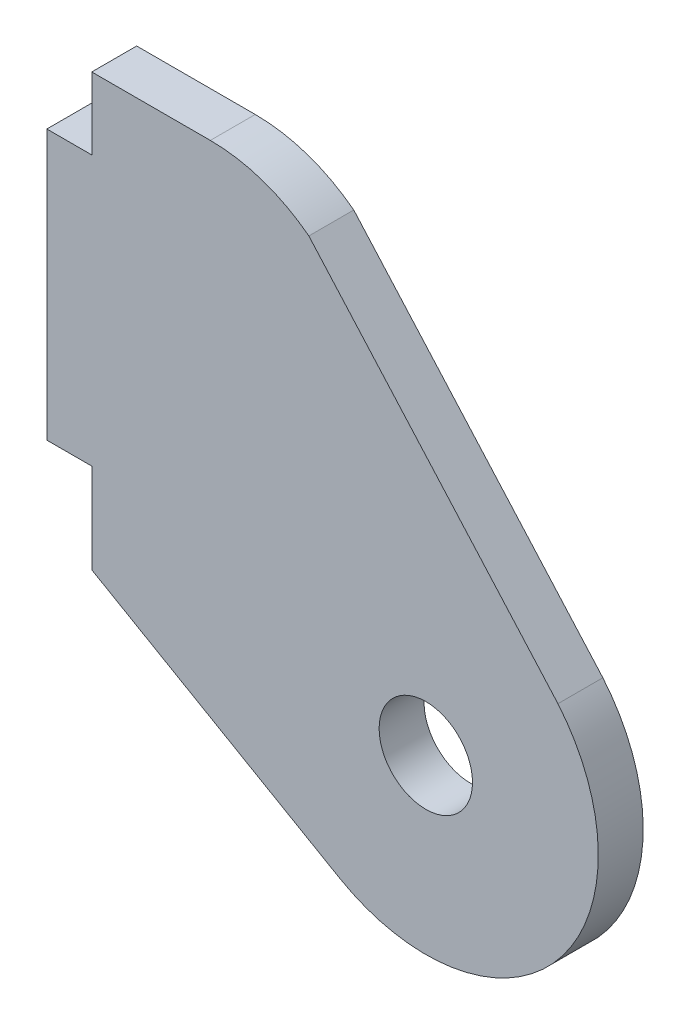
ISO-10303-21;
HEADER;
FILE_DESCRIPTION(('STEP AP214'),'2;1');
FILE_NAME('part.step','',(''),(''),'','','');
FILE_SCHEMA(('AUTOMOTIVE_DESIGN { 1 0 10303 214 1 1 1 1 }'));
ENDSEC;
DATA;
#1=APPLICATION_CONTEXT('core data for automotive mechanical design processes');
#2=APPLICATION_PROTOCOL_DEFINITION('international standard','automotive_design',2000,#1);
#3=PRODUCT_CONTEXT('',#1,'mechanical');
#4=PRODUCT('Part','Part','',(#3));
#5=PRODUCT_RELATED_PRODUCT_CATEGORY('part','',(#4));
#6=PRODUCT_DEFINITION_FORMATION('','',#4);
#7=PRODUCT_DEFINITION_CONTEXT('part definition',#1,'design');
#8=PRODUCT_DEFINITION('design','',#6,#7);
#9=PRODUCT_DEFINITION_SHAPE('','',#8);
#10=(LENGTH_UNIT() NAMED_UNIT(*) SI_UNIT(.MILLI.,.METRE.));
#11=(NAMED_UNIT(*) PLANE_ANGLE_UNIT() SI_UNIT($,.RADIAN.));
#12=(NAMED_UNIT(*) SI_UNIT($,.STERADIAN.) SOLID_ANGLE_UNIT());
#13=UNCERTAINTY_MEASURE_WITH_UNIT(LENGTH_MEASURE(1.E-05),#10,'distance_accuracy_value','');
#14=(GEOMETRIC_REPRESENTATION_CONTEXT(3) GLOBAL_UNCERTAINTY_ASSIGNED_CONTEXT((#13)) GLOBAL_UNIT_ASSIGNED_CONTEXT((#10,
#11,#12)) REPRESENTATION_CONTEXT('',''));
#15=CARTESIAN_POINT('',(0.,0.,0.));
#16=DIRECTION('',(0.,0.,1.));
#17=DIRECTION('',(1.,0.,0.));
#18=AXIS2_PLACEMENT_3D('',#15,#16,#17);
#19=CARTESIAN_POINT('',(-79.4095433377579,-48.870574021423,3.175));
#20=DIRECTION('',(0.,1.,0.));
#21=DIRECTION('',(0.,0.,1.));
#22=AXIS2_PLACEMENT_3D('',#19,#20,#21);
#23=PLANE('',#22);
#24=DIRECTION('',(1.,0.,0.));
#25=VECTOR('',#24,1.);
#26=CARTESIAN_POINT('',(-79.4095433377579,-48.870574021423,0.));
#27=LINE('',#26,#25);
#28=CARTESIAN_POINT('',(-79.4095433377579,-48.870574021423,0.));
#29=VERTEX_POINT('',#28);
#30=CARTESIAN_POINT('',(-76.2345433377579,-48.870574021423,0.));
#31=VERTEX_POINT('',#30);
#32=EDGE_CURVE('E141',#29,#31,#27,.T.);
#33=ORIENTED_EDGE('',*,*,#32,.T.);
#34=DIRECTION('',(0.,0.,-1.));
#35=VECTOR('',#34,1.);
#36=CARTESIAN_POINT('',(-76.2345433377579,-48.870574021423,3.175));
#37=LINE('',#36,#35);
#38=CARTESIAN_POINT('',(-76.2345433377579,-48.870574021423,3.175));
#39=VERTEX_POINT('',#38);
#40=EDGE_CURVE('E11',#39,#31,#37,.T.);
#41=ORIENTED_EDGE('',*,*,#40,.F.);
#42=DIRECTION('',(1.,0.,0.));
#43=VECTOR('',#42,1.);
#44=CARTESIAN_POINT('',(-79.4095433377579,-48.870574021423,3.175));
#45=LINE('',#44,#43);
#46=CARTESIAN_POINT('',(-79.4095433377579,-48.870574021423,3.175));
#47=VERTEX_POINT('',#46);
#48=EDGE_CURVE('E160',#47,#39,#45,.T.);
#49=ORIENTED_EDGE('',*,*,#48,.F.);
#50=DIRECTION('',(0.,0.,-1.));
#51=VECTOR('',#50,1.);
#52=CARTESIAN_POINT('',(-79.4095433377579,-48.870574021423,3.175));
#53=LINE('',#52,#51);
#54=EDGE_CURVE('E137',#47,#29,#53,.T.);
#55=ORIENTED_EDGE('',*,*,#54,.T.);
#56=EDGE_LOOP('',(#33,#41,#49,#55));
#57=FACE_BOUND('',#56,.T.);
#58=ADVANCED_FACE('F33',(#57),#23,.F.);
#59=CARTESIAN_POINT('',(-76.2345433377579,-48.870574021423,3.175));
#60=DIRECTION('',(1.,0.,0.));
#61=DIRECTION('',(0.,1.,0.));
#62=AXIS2_PLACEMENT_3D('',#59,#60,#61);
#63=PLANE('',#62);
#64=DIRECTION('',(0.,-1.,0.));
#65=VECTOR('',#64,1.);
#66=CARTESIAN_POINT('',(-76.2345433377579,-48.870574021423,0.));
#67=LINE('',#66,#65);
#68=CARTESIAN_POINT('',(-76.2345433377579,-55.220574021423,0.));
#69=VERTEX_POINT('',#68);
#70=EDGE_CURVE('E144',#31,#69,#67,.T.);
#71=ORIENTED_EDGE('',*,*,#70,.T.);
#72=DIRECTION('',(0.,0.,-1.));
#73=VECTOR('',#72,1.);
#74=CARTESIAN_POINT('',(-76.2345433377579,-55.220574021423,3.175));
#75=LINE('',#74,#73);
#76=CARTESIAN_POINT('',(-76.2345433377579,-55.220574021423,3.175));
#77=VERTEX_POINT('',#76);
#78=EDGE_CURVE('E41',#77,#69,#75,.T.);
#79=ORIENTED_EDGE('',*,*,#78,.F.);
#80=DIRECTION('',(0.,-1.,0.));
#81=VECTOR('',#80,1.);
#82=CARTESIAN_POINT('',(-76.2345433377579,-48.870574021423,3.175));
#83=LINE('',#82,#81);
#84=EDGE_CURVE('E98',#39,#77,#83,.T.);
#85=ORIENTED_EDGE('',*,*,#84,.F.);
#86=ORIENTED_EDGE('',*,*,#40,.T.);
#87=EDGE_LOOP('',(#71,#79,#85,#86));
#88=FACE_BOUND('',#87,.T.);
#89=ADVANCED_FACE('F228',(#88),#63,.F.);
#90=CARTESIAN_POINT('',(-76.2345433377579,-55.220574021423,3.175));
#91=DIRECTION('',(0.499999999999998,0.86602540378444,0.));
#92=DIRECTION('',(-0.86602540378444,0.499999999999998,0.));
#93=AXIS2_PLACEMENT_3D('',#90,#91,#92);
#94=PLANE('',#93);
#95=DIRECTION('',(0.86602540378444,-0.499999999999998,0.));
#96=VECTOR('',#95,1.);
#97=CARTESIAN_POINT('',(-76.2345433377579,-55.220574021423,0.));
#98=LINE('',#97,#96);
#99=CARTESIAN_POINT('',(-58.7169060337579,-65.3343866344536,0.));
#100=VERTEX_POINT('',#99);
#101=EDGE_CURVE('E147',#69,#100,#98,.T.);
#102=ORIENTED_EDGE('',*,*,#101,.T.);
#103=DIRECTION('',(0.,0.,-1.));
#104=VECTOR('',#103,1.);
#105=CARTESIAN_POINT('',(-58.7169060337579,-65.3343866344536,3.175));
#106=LINE('',#105,#104);
#107=CARTESIAN_POINT('',(-58.7169060337579,-65.3343866344536,3.175));
#108=VERTEX_POINT('',#107);
#109=EDGE_CURVE('E173',#108,#100,#106,.T.);
#110=ORIENTED_EDGE('',*,*,#109,.F.);
#111=DIRECTION('',(0.86602540378444,-0.499999999999998,0.));
#112=VECTOR('',#111,1.);
#113=CARTESIAN_POINT('',(-76.2345433377579,-55.220574021423,3.175));
#114=LINE('',#113,#112);
#115=EDGE_CURVE('E181',#77,#108,#114,.T.);
#116=ORIENTED_EDGE('',*,*,#115,.F.);
#117=ORIENTED_EDGE('',*,*,#78,.T.);
#118=EDGE_LOOP('',(#102,#110,#116,#117));
#119=FACE_BOUND('',#118,.T.);
#120=ADVANCED_FACE('F179',(#119),#94,.F.);
#121=CARTESIAN_POINT('',(-52.6209060337579,-54.7758049115137,3.175));
#122=DIRECTION('',(0.,0.,-1.));
#123=DIRECTION('',(-1.,0.,0.));
#124=AXIS2_PLACEMENT_3D('',#121,#122,#123);
#125=CYLINDRICAL_SURFACE('',#124,12.192);
#126=CARTESIAN_POINT('',(-52.6209060337579,-54.7758049115137,0.));
#127=DIRECTION('',(0.,0.,1.));
#128=DIRECTION('',(1.,0.,0.));
#129=AXIS2_PLACEMENT_3D('',#126,#127,#128);
#130=CIRCLE('',#129,12.192);
#131=CARTESIAN_POINT('',(-43.2812921832514,-46.9389383742153,0.));
#132=VERTEX_POINT('',#131);
#133=EDGE_CURVE('E149',#100,#132,#130,.T.);
#134=ORIENTED_EDGE('',*,*,#133,.T.);
#135=DIRECTION('',(0.,0.,-1.));
#136=VECTOR('',#135,1.);
#137=CARTESIAN_POINT('',(-43.2812921832514,-46.9389383742153,3.175));
#138=LINE('',#137,#136);
#139=CARTESIAN_POINT('',(-43.2812921832514,-46.9389383742153,3.175));
#140=VERTEX_POINT('',#139);
#141=EDGE_CURVE('E170',#140,#132,#138,.T.);
#142=ORIENTED_EDGE('',*,*,#141,.F.);
#143=CARTESIAN_POINT('',(-52.6209060337579,-54.7758049115137,3.175));
#144=DIRECTION('',(0.,0.,1.));
#145=DIRECTION('',(1.,0.,0.));
#146=AXIS2_PLACEMENT_3D('',#143,#144,#145);
#147=CIRCLE('',#146,12.192);
#148=EDGE_CURVE('E199',#108,#140,#147,.T.);
#149=ORIENTED_EDGE('',*,*,#148,.F.);
#150=ORIENTED_EDGE('',*,*,#109,.T.);
#151=EDGE_LOOP('',(#134,#142,#149,#150));
#152=FACE_BOUND('',#151,.T.);
#153=ADVANCED_FACE('F190',(#152),#125,.T.);
#154=CARTESIAN_POINT('',(-60.8896531494987,-27.1061898599786,3.175));
#155=DIRECTION('',(-0.747797662430407,-0.663926694796661,0.));
#156=DIRECTION('',(0.663926694796661,-0.747797662430407,0.));
#157=AXIS2_PLACEMENT_3D('',#154,#155,#156);
#158=PLANE('',#157);
#159=DIRECTION('',(-0.663926694796661,0.747797662430407,0.));
#160=VECTOR('',#159,1.);
#161=CARTESIAN_POINT('',(-60.8896531494987,-27.1061898599786,0.));
#162=LINE('',#161,#160);
#163=CARTESIAN_POINT('',(-60.8896531494987,-27.1061898599786,0.));
#164=VERTEX_POINT('',#163);
#165=EDGE_CURVE('E151',#132,#164,#162,.T.);
#166=ORIENTED_EDGE('',*,*,#165,.T.);
#167=DIRECTION('',(0.,0.,-1.));
#168=VECTOR('',#167,1.);
#169=CARTESIAN_POINT('',(-60.8896531494987,-27.1061898599786,3.175));
#170=LINE('',#169,#168);
#171=CARTESIAN_POINT('',(-60.8896531494987,-27.1061898599786,3.175));
#172=VERTEX_POINT('',#171);
#173=EDGE_CURVE('E167',#172,#164,#170,.T.);
#174=ORIENTED_EDGE('',*,*,#173,.F.);
#175=DIRECTION('',(-0.663926694796661,0.747797662430407,0.));
#176=VECTOR('',#175,1.);
#177=CARTESIAN_POINT('',(-60.8896531494987,-27.1061898599786,3.175));
#178=LINE('',#177,#176);
#179=EDGE_CURVE('E196',#140,#172,#178,.T.);
#180=ORIENTED_EDGE('',*,*,#179,.F.);
#181=ORIENTED_EDGE('',*,*,#141,.T.);
#182=EDGE_LOOP('',(#166,#174,#180,#181));
#183=FACE_BOUND('',#182,.T.);
#184=ADVANCED_FACE('F194',(#183),#158,.F.);
#185=CARTESIAN_POINT('',(-67.8525433377579,-36.170574021423,3.175));
#186=DIRECTION('',(0.,0.,-1.));
#187=DIRECTION('',(-1.,0.,0.));
#188=AXIS2_PLACEMENT_3D('',#185,#186,#187);
#189=CYLINDRICAL_SURFACE('',#188,11.43);
#190=CARTESIAN_POINT('',(-67.8525433377579,-36.170574021423,0.));
#191=DIRECTION('',(0.,0.,1.));
#192=DIRECTION('',(-1.,0.,0.));
#193=AXIS2_PLACEMENT_3D('',#190,#191,#192);
#194=CIRCLE('',#193,11.43);
#195=CARTESIAN_POINT('',(-67.8525433377579,-24.740574021423,0.));
#196=VERTEX_POINT('',#195);
#197=EDGE_CURVE('E153',#164,#196,#194,.T.);
#198=ORIENTED_EDGE('',*,*,#197,.T.);
#199=DIRECTION('',(0.,0.,-1.));
#200=VECTOR('',#199,1.);
#201=CARTESIAN_POINT('',(-67.8525433377579,-24.740574021423,3.175));
#202=LINE('',#201,#200);
#203=CARTESIAN_POINT('',(-67.8525433377579,-24.740574021423,3.175));
#204=VERTEX_POINT('',#203);
#205=EDGE_CURVE('E164',#204,#196,#202,.T.);
#206=ORIENTED_EDGE('',*,*,#205,.F.);
#207=CARTESIAN_POINT('',(-67.8525433377579,-36.170574021423,3.175));
#208=DIRECTION('',(0.,0.,1.));
#209=DIRECTION('',(-1.,0.,0.));
#210=AXIS2_PLACEMENT_3D('',#207,#208,#209);
#211=CIRCLE('',#210,11.43);
#212=EDGE_CURVE('E198',#172,#204,#211,.T.);
#213=ORIENTED_EDGE('',*,*,#212,.F.);
#214=ORIENTED_EDGE('',*,*,#173,.T.);
#215=EDGE_LOOP('',(#198,#206,#213,#214));
#216=FACE_BOUND('',#215,.T.);
#217=ADVANCED_FACE('F240',(#216),#189,.T.);
#218=CARTESIAN_POINT('',(-76.2345433377579,-24.740574021423,3.175));
#219=DIRECTION('',(0.,-1.,0.));
#220=DIRECTION('',(0.,0.,-1.));
#221=AXIS2_PLACEMENT_3D('',#218,#219,#220);
#222=PLANE('',#221);
#223=DIRECTION('',(-1.,0.,0.));
#224=VECTOR('',#223,1.);
#225=CARTESIAN_POINT('',(-76.2345433377579,-24.740574021423,0.));
#226=LINE('',#225,#224);
#227=CARTESIAN_POINT('',(-76.2345433377579,-24.740574021423,0.));
#228=VERTEX_POINT('',#227);
#229=EDGE_CURVE('E155',#196,#228,#226,.T.);
#230=ORIENTED_EDGE('',*,*,#229,.T.);
#231=DIRECTION('',(0.,0.,-1.));
#232=VECTOR('',#231,1.);
#233=CARTESIAN_POINT('',(-76.2345433377579,-24.740574021423,3.175));
#234=LINE('',#233,#232);
#235=CARTESIAN_POINT('',(-76.2345433377579,-24.740574021423,3.175));
#236=VERTEX_POINT('',#235);
#237=EDGE_CURVE('E132',#236,#228,#234,.T.);
#238=ORIENTED_EDGE('',*,*,#237,.F.);
#239=DIRECTION('',(-1.,0.,0.));
#240=VECTOR('',#239,1.);
#241=CARTESIAN_POINT('',(-76.2345433377579,-24.740574021423,3.175));
#242=LINE('',#241,#240);
#243=EDGE_CURVE('E123',#204,#236,#242,.T.);
#244=ORIENTED_EDGE('',*,*,#243,.F.);
#245=ORIENTED_EDGE('',*,*,#205,.T.);
#246=EDGE_LOOP('',(#230,#238,#244,#245));
#247=FACE_BOUND('',#246,.T.);
#248=ADVANCED_FACE('F237',(#247),#222,.F.);
#249=CARTESIAN_POINT('',(-76.2345433377579,-29.820574021423,3.175));
#250=DIRECTION('',(1.,0.,0.));
#251=DIRECTION('',(0.,0.,-1.));
#252=AXIS2_PLACEMENT_3D('',#249,#250,#251);
#253=PLANE('',#252);
#254=DIRECTION('',(0.,-1.,0.));
#255=VECTOR('',#254,1.);
#256=CARTESIAN_POINT('',(-76.2345433377579,-29.820574021423,0.));
#257=LINE('',#256,#255);
#258=CARTESIAN_POINT('',(-76.2345433377579,-29.820574021423,0.));
#259=VERTEX_POINT('',#258);
#260=EDGE_CURVE('E131',#228,#259,#257,.T.);
#261=ORIENTED_EDGE('',*,*,#260,.T.);
#262=DIRECTION('',(0.,0.,-1.));
#263=VECTOR('',#262,1.);
#264=CARTESIAN_POINT('',(-76.2345433377579,-29.820574021423,3.175));
#265=LINE('',#264,#263);
#266=CARTESIAN_POINT('',(-76.2345433377579,-29.820574021423,3.175));
#267=VERTEX_POINT('',#266);
#268=EDGE_CURVE('E128',#267,#259,#265,.T.);
#269=ORIENTED_EDGE('',*,*,#268,.F.);
#270=DIRECTION('',(0.,-1.,0.));
#271=VECTOR('',#270,1.);
#272=CARTESIAN_POINT('',(-76.2345433377579,-29.820574021423,3.175));
#273=LINE('',#272,#271);
#274=EDGE_CURVE('E117',#236,#267,#273,.T.);
#275=ORIENTED_EDGE('',*,*,#274,.F.);
#276=ORIENTED_EDGE('',*,*,#237,.T.);
#277=EDGE_LOOP('',(#261,#269,#275,#276));
#278=FACE_BOUND('',#277,.T.);
#279=ADVANCED_FACE('F129',(#278),#253,.F.);
#280=CARTESIAN_POINT('',(-79.4095433377579,-29.820574021423,3.175));
#281=DIRECTION('',(0.,-1.,0.));
#282=DIRECTION('',(0.,0.,-1.));
#283=AXIS2_PLACEMENT_3D('',#280,#281,#282);
#284=PLANE('',#283);
#285=DIRECTION('',(-1.,0.,0.));
#286=VECTOR('',#285,1.);
#287=CARTESIAN_POINT('',(-79.4095433377579,-29.820574021423,0.));
#288=LINE('',#287,#286);
#289=CARTESIAN_POINT('',(-79.4095433377579,-29.820574021423,0.));
#290=VERTEX_POINT('',#289);
#291=EDGE_CURVE('E84',#259,#290,#288,.T.);
#292=ORIENTED_EDGE('',*,*,#291,.T.);
#293=DIRECTION('',(0.,0.,-1.));
#294=VECTOR('',#293,1.);
#295=CARTESIAN_POINT('',(-79.4095433377579,-29.820574021423,3.175));
#296=LINE('',#295,#294);
#297=CARTESIAN_POINT('',(-79.4095433377579,-29.820574021423,3.175));
#298=VERTEX_POINT('',#297);
#299=EDGE_CURVE('E133',#298,#290,#296,.T.);
#300=ORIENTED_EDGE('',*,*,#299,.F.);
#301=DIRECTION('',(-1.,0.,0.));
#302=VECTOR('',#301,1.);
#303=CARTESIAN_POINT('',(-79.4095433377579,-29.820574021423,3.175));
#304=LINE('',#303,#302);
#305=EDGE_CURVE('E121',#267,#298,#304,.T.);
#306=ORIENTED_EDGE('',*,*,#305,.F.);
#307=ORIENTED_EDGE('',*,*,#268,.T.);
#308=EDGE_LOOP('',(#292,#300,#306,#307));
#309=FACE_BOUND('',#308,.T.);
#310=ADVANCED_FACE('F135',(#309),#284,.F.);
#311=CARTESIAN_POINT('',(-79.4095433377579,-48.870574021423,3.175));
#312=DIRECTION('',(1.,0.,0.));
#313=DIRECTION('',(0.,0.,-1.));
#314=AXIS2_PLACEMENT_3D('',#311,#312,#313);
#315=PLANE('',#314);
#316=DIRECTION('',(0.,-1.,0.));
#317=VECTOR('',#316,1.);
#318=CARTESIAN_POINT('',(-79.4095433377579,-48.870574021423,0.));
#319=LINE('',#318,#317);
#320=EDGE_CURVE('E90',#290,#29,#319,.T.);
#321=ORIENTED_EDGE('',*,*,#320,.T.);
#322=ORIENTED_EDGE('',*,*,#54,.F.);
#323=DIRECTION('',(0.,-1.,0.));
#324=VECTOR('',#323,1.);
#325=CARTESIAN_POINT('',(-79.4095433377579,-48.870574021423,3.175));
#326=LINE('',#325,#324);
#327=EDGE_CURVE('E49',#298,#47,#326,.T.);
#328=ORIENTED_EDGE('',*,*,#327,.F.);
#329=ORIENTED_EDGE('',*,*,#299,.T.);
#330=EDGE_LOOP('',(#321,#322,#328,#329));
#331=FACE_BOUND('',#330,.T.);
#332=ADVANCED_FACE('F223',(#331),#315,.F.);
#333=CARTESIAN_POINT('',(-52.6209060337579,-54.7758049115137,3.175));
#334=DIRECTION('',(0.,0.,1.));
#335=DIRECTION('',(1.,0.,0.));
#336=AXIS2_PLACEMENT_3D('',#333,#334,#335);
#337=PLANE('',#336);
#338=CARTESIAN_POINT('',(-52.6209060337579,-54.7758049115137,3.175));
#339=DIRECTION('',(0.,0.,1.));
#340=DIRECTION('',(1.,0.,0.));
#341=AXIS2_PLACEMENT_3D('',#338,#339,#340);
#342=CIRCLE('',#341,3.3);
#343=CARTESIAN_POINT('',(-49.3209060337579,-54.7758049115137,3.175));
#344=VERTEX_POINT('',#343);
#345=EDGE_CURVE('E145',#344,#344,#342,.T.);
#346=ORIENTED_EDGE('',*,*,#345,.F.);
#347=EDGE_LOOP('',(#346));
#348=FACE_BOUND('',#347,.T.);
#349=ORIENTED_EDGE('',*,*,#48,.T.);
#350=ORIENTED_EDGE('',*,*,#84,.T.);
#351=ORIENTED_EDGE('',*,*,#115,.T.);
#352=ORIENTED_EDGE('',*,*,#148,.T.);
#353=ORIENTED_EDGE('',*,*,#179,.T.);
#354=ORIENTED_EDGE('',*,*,#212,.T.);
#355=ORIENTED_EDGE('',*,*,#243,.T.);
#356=ORIENTED_EDGE('',*,*,#274,.T.);
#357=ORIENTED_EDGE('',*,*,#305,.T.);
#358=ORIENTED_EDGE('',*,*,#327,.T.);
#359=EDGE_LOOP('',(#349,#350,#351,#352,#353,#354,#355,#356,#357,#358));
#360=FACE_BOUND('',#359,.T.);
#361=ADVANCED_FACE('F119',(#348,#360),#337,.T.);
#362=CARTESIAN_POINT('',(-52.6209060337579,-54.7758049115137,0.));
#363=DIRECTION('',(0.,0.,1.));
#364=DIRECTION('',(1.,0.,0.));
#365=AXIS2_PLACEMENT_3D('',#362,#363,#364);
#366=PLANE('',#365);
#367=CARTESIAN_POINT('',(-52.6209060337579,-54.7758049115137,0.));
#368=DIRECTION('',(0.,0.,-1.));
#369=DIRECTION('',(-1.,0.,0.));
#370=AXIS2_PLACEMENT_3D('',#367,#368,#369);
#371=CIRCLE('',#370,3.3);
#372=CARTESIAN_POINT('',(-55.9209060337579,-54.7758049115137,0.));
#373=VERTEX_POINT('',#372);
#374=EDGE_CURVE('E209',#373,#373,#371,.T.);
#375=ORIENTED_EDGE('',*,*,#374,.F.);
#376=EDGE_LOOP('',(#375));
#377=FACE_BOUND('',#376,.T.);
#378=ORIENTED_EDGE('',*,*,#32,.F.);
#379=ORIENTED_EDGE('',*,*,#320,.F.);
#380=ORIENTED_EDGE('',*,*,#291,.F.);
#381=ORIENTED_EDGE('',*,*,#260,.F.);
#382=ORIENTED_EDGE('',*,*,#229,.F.);
#383=ORIENTED_EDGE('',*,*,#197,.F.);
#384=ORIENTED_EDGE('',*,*,#165,.F.);
#385=ORIENTED_EDGE('',*,*,#133,.F.);
#386=ORIENTED_EDGE('',*,*,#101,.F.);
#387=ORIENTED_EDGE('',*,*,#70,.F.);
#388=EDGE_LOOP('',(#378,#379,#380,#381,#382,#383,#384,#385,#386,#387));
#389=FACE_BOUND('',#388,.T.);
#390=ADVANCED_FACE('F185',(#377,#389),#366,.F.);
#391=CARTESIAN_POINT('',(-52.6209060337579,-54.7758049115137,0.));
#392=DIRECTION('',(0.,0.,-1.));
#393=DIRECTION('',(-1.,0.,0.));
#394=AXIS2_PLACEMENT_3D('',#391,#392,#393);
#395=CYLINDRICAL_SURFACE('',#394,3.3);
#396=ORIENTED_EDGE('',*,*,#345,.T.);
#397=EDGE_LOOP('',(#396));
#398=FACE_BOUND('',#397,.T.);
#399=ORIENTED_EDGE('',*,*,#374,.T.);
#400=EDGE_LOOP('',(#399));
#401=FACE_BOUND('',#400,.T.);
#402=ADVANCED_FACE('F213',(#398,#401),#395,.F.);
#403=CLOSED_SHELL('',(#58,#89,#120,#153,#184,#217,#248,#279,#310,#332,#361,#390,#402));
#404=MANIFOLD_SOLID_BREP('B2',#403);
#405=ADVANCED_BREP_SHAPE_REPRESENTATION('',(#18,#404),#14);
#406=SHAPE_DEFINITION_REPRESENTATION(#9,#405);
ENDSEC;
END-ISO-10303-21;
